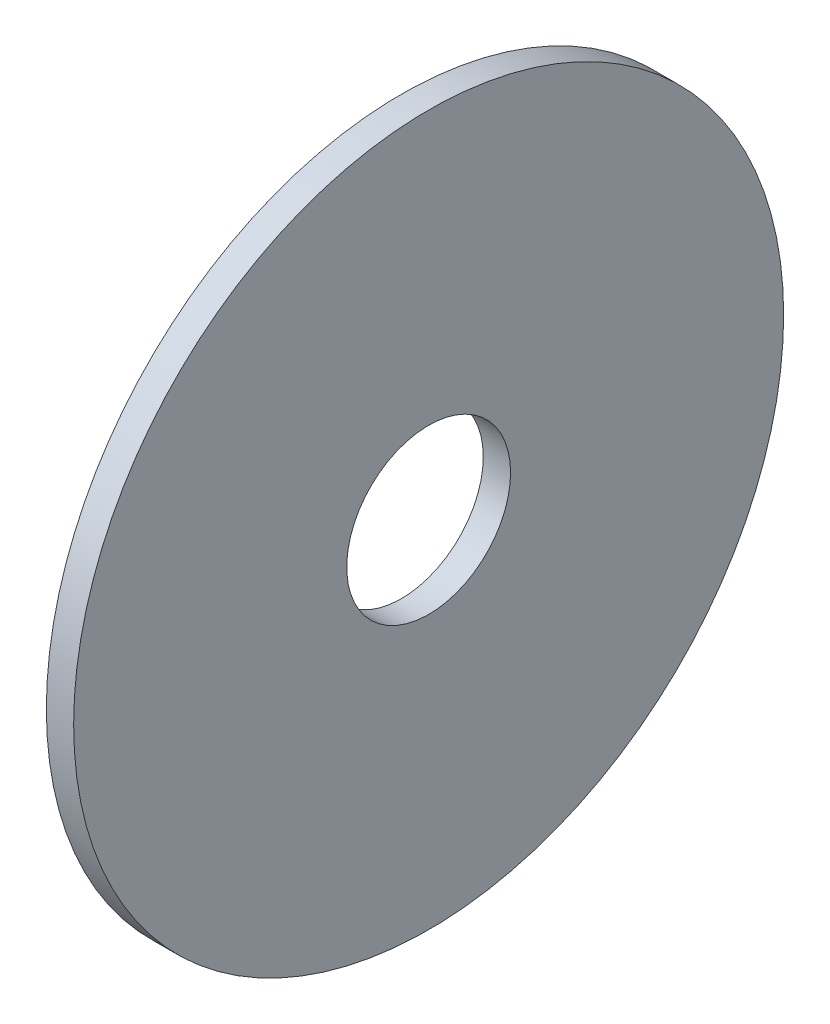
ISO-10303-21;
HEADER;
FILE_DESCRIPTION(('STEP AP214'),'2;1');
FILE_NAME('part.step','',(''),(''),'','','');
FILE_SCHEMA(('AUTOMOTIVE_DESIGN { 1 0 10303 214 1 1 1 1 }'));
ENDSEC;
DATA;
#1=APPLICATION_CONTEXT('core data for automotive mechanical design processes');
#2=APPLICATION_PROTOCOL_DEFINITION('international standard','automotive_design',2000,#1);
#3=PRODUCT_CONTEXT('',#1,'mechanical');
#4=PRODUCT('Part','Part','',(#3));
#5=PRODUCT_RELATED_PRODUCT_CATEGORY('part','',(#4));
#6=PRODUCT_DEFINITION_FORMATION('','',#4);
#7=PRODUCT_DEFINITION_CONTEXT('part definition',#1,'design');
#8=PRODUCT_DEFINITION('design','',#6,#7);
#9=PRODUCT_DEFINITION_SHAPE('','',#8);
#10=(LENGTH_UNIT() NAMED_UNIT(*) SI_UNIT(.MILLI.,.METRE.));
#11=(NAMED_UNIT(*) PLANE_ANGLE_UNIT() SI_UNIT($,.RADIAN.));
#12=(NAMED_UNIT(*) SI_UNIT($,.STERADIAN.) SOLID_ANGLE_UNIT());
#13=UNCERTAINTY_MEASURE_WITH_UNIT(LENGTH_MEASURE(1.E-05),#10,'distance_accuracy_value','');
#14=(GEOMETRIC_REPRESENTATION_CONTEXT(3) GLOBAL_UNCERTAINTY_ASSIGNED_CONTEXT((#13)) GLOBAL_UNIT_ASSIGNED_CONTEXT((#10,
#11,#12)) REPRESENTATION_CONTEXT('',''));
#15=CARTESIAN_POINT('',(0.,0.,0.));
#16=DIRECTION('',(0.,0.,1.));
#17=DIRECTION('',(1.,0.,0.));
#18=AXIS2_PLACEMENT_3D('',#15,#16,#17);
#19=CARTESIAN_POINT('',(-3.,0.,0.));
#20=DIRECTION('',(1.,0.,0.));
#21=DIRECTION('',(0.,0.,-1.));
#22=AXIS2_PLACEMENT_3D('',#19,#20,#21);
#23=CYLINDRICAL_SURFACE('',#22,39.);
#24=CARTESIAN_POINT('',(-3.,0.,0.));
#25=DIRECTION('',(1.,0.,0.));
#26=DIRECTION('',(0.,0.,-1.));
#27=AXIS2_PLACEMENT_3D('',#24,#25,#26);
#28=CIRCLE('',#27,39.);
#29=CARTESIAN_POINT('',(-3.,0.,-39.));
#30=VERTEX_POINT('',#29);
#31=EDGE_CURVE('E10',#30,#30,#28,.T.);
#32=ORIENTED_EDGE('',*,*,#31,.T.);
#33=EDGE_LOOP('',(#32));
#34=FACE_BOUND('',#33,.T.);
#35=CARTESIAN_POINT('',(0.,0.,0.));
#36=DIRECTION('',(1.,0.,0.));
#37=DIRECTION('',(0.,0.,-1.));
#38=AXIS2_PLACEMENT_3D('',#35,#36,#37);
#39=CIRCLE('',#38,39.);
#40=CARTESIAN_POINT('',(0.,0.,-39.));
#41=VERTEX_POINT('',#40);
#42=EDGE_CURVE('E44',#41,#41,#39,.T.);
#43=ORIENTED_EDGE('',*,*,#42,.F.);
#44=EDGE_LOOP('',(#43));
#45=FACE_BOUND('',#44,.T.);
#46=ADVANCED_FACE('F41',(#34,#45),#23,.T.);
#47=CARTESIAN_POINT('',(-3.,0.,0.));
#48=DIRECTION('',(1.,0.,0.));
#49=DIRECTION('',(0.,0.,-1.));
#50=AXIS2_PLACEMENT_3D('',#47,#48,#49);
#51=PLANE('',#50);
#52=CARTESIAN_POINT('',(-3.,0.,0.));
#53=DIRECTION('',(1.,0.,0.));
#54=DIRECTION('',(0.,0.,-1.));
#55=AXIS2_PLACEMENT_3D('',#52,#53,#54);
#56=CIRCLE('',#55,9.);
#57=CARTESIAN_POINT('',(-3.,0.,-9.));
#58=VERTEX_POINT('',#57);
#59=EDGE_CURVE('E51',#58,#58,#56,.T.);
#60=ORIENTED_EDGE('',*,*,#59,.T.);
#61=EDGE_LOOP('',(#60));
#62=FACE_BOUND('',#61,.T.);
#63=ORIENTED_EDGE('',*,*,#31,.F.);
#64=EDGE_LOOP('',(#63));
#65=FACE_BOUND('',#64,.T.);
#66=ADVANCED_FACE('F59',(#62,#65),#51,.F.);
#67=CARTESIAN_POINT('',(0.,0.,0.));
#68=DIRECTION('',(1.,0.,0.));
#69=DIRECTION('',(0.,0.,-1.));
#70=AXIS2_PLACEMENT_3D('',#67,#68,#69);
#71=PLANE('',#70);
#72=CARTESIAN_POINT('',(0.,0.,0.));
#73=DIRECTION('',(1.,0.,0.));
#74=DIRECTION('',(0.,0.,-1.));
#75=AXIS2_PLACEMENT_3D('',#72,#73,#74);
#76=CIRCLE('',#75,9.);
#77=CARTESIAN_POINT('',(0.,0.,-9.));
#78=VERTEX_POINT('',#77);
#79=EDGE_CURVE('E53',#78,#78,#76,.T.);
#80=ORIENTED_EDGE('',*,*,#79,.F.);
#81=EDGE_LOOP('',(#80));
#82=FACE_BOUND('',#81,.T.);
#83=ORIENTED_EDGE('',*,*,#42,.T.);
#84=EDGE_LOOP('',(#83));
#85=FACE_BOUND('',#84,.T.);
#86=ADVANCED_FACE('F65',(#82,#85),#71,.T.);
#87=CARTESIAN_POINT('',(-3.,0.,0.));
#88=DIRECTION('',(1.,0.,0.));
#89=DIRECTION('',(0.,0.,-1.));
#90=AXIS2_PLACEMENT_3D('',#87,#88,#89);
#91=CYLINDRICAL_SURFACE('',#90,9.);
#92=ORIENTED_EDGE('',*,*,#59,.F.);
#93=EDGE_LOOP('',(#92));
#94=FACE_BOUND('',#93,.T.);
#95=ORIENTED_EDGE('',*,*,#79,.T.);
#96=EDGE_LOOP('',(#95));
#97=FACE_BOUND('',#96,.T.);
#98=ADVANCED_FACE('F62',(#94,#97),#91,.F.);
#99=CLOSED_SHELL('',(#46,#66,#86,#98));
#100=MANIFOLD_SOLID_BREP('B2',#99);
#101=ADVANCED_BREP_SHAPE_REPRESENTATION('',(#18,#100),#14);
#102=SHAPE_DEFINITION_REPRESENTATION(#9,#101);
ENDSEC;
END-ISO-10303-21;
